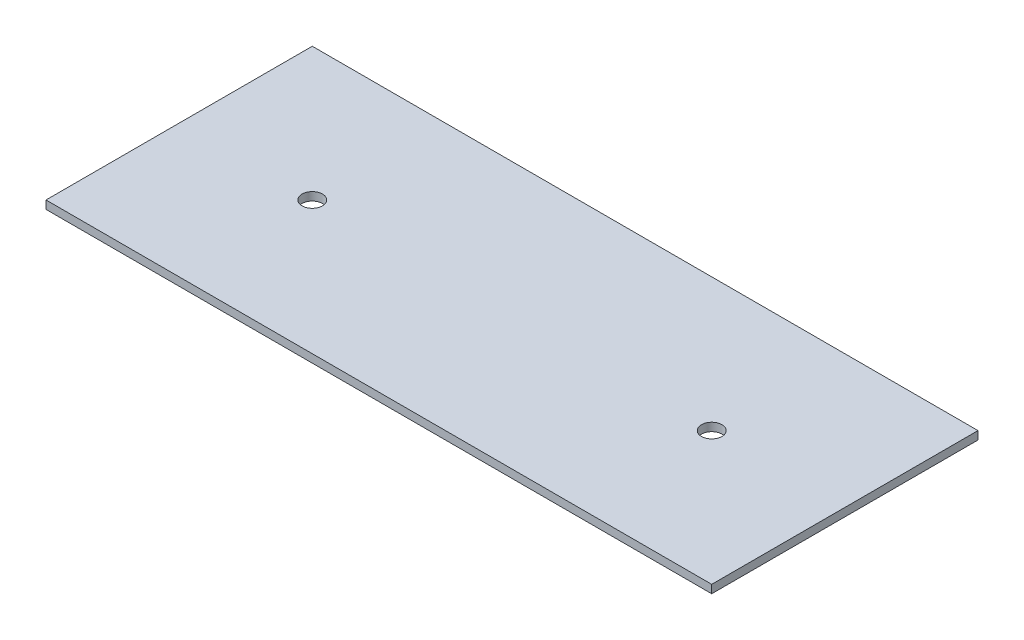
ISO-10303-21;
HEADER;
FILE_DESCRIPTION(('STEP AP214'),'2;1');
FILE_NAME('part.step','',(''),(''),'','','');
FILE_SCHEMA(('AUTOMOTIVE_DESIGN { 1 0 10303 214 1 1 1 1 }'));
ENDSEC;
DATA;
#1=APPLICATION_CONTEXT('core data for automotive mechanical design processes');
#2=APPLICATION_PROTOCOL_DEFINITION('international standard','automotive_design',2000,#1);
#3=PRODUCT_CONTEXT('',#1,'mechanical');
#4=PRODUCT('Part','Part','',(#3));
#5=PRODUCT_RELATED_PRODUCT_CATEGORY('part','',(#4));
#6=PRODUCT_DEFINITION_FORMATION('','',#4);
#7=PRODUCT_DEFINITION_CONTEXT('part definition',#1,'design');
#8=PRODUCT_DEFINITION('design','',#6,#7);
#9=PRODUCT_DEFINITION_SHAPE('','',#8);
#10=(LENGTH_UNIT() NAMED_UNIT(*) SI_UNIT(.MILLI.,.METRE.));
#11=(NAMED_UNIT(*) PLANE_ANGLE_UNIT() SI_UNIT($,.RADIAN.));
#12=(NAMED_UNIT(*) SI_UNIT($,.STERADIAN.) SOLID_ANGLE_UNIT());
#13=UNCERTAINTY_MEASURE_WITH_UNIT(LENGTH_MEASURE(1.E-05),#10,'distance_accuracy_value','');
#14=(GEOMETRIC_REPRESENTATION_CONTEXT(3) GLOBAL_UNCERTAINTY_ASSIGNED_CONTEXT((#13)) GLOBAL_UNIT_ASSIGNED_CONTEXT((#10,
#11,#12)) REPRESENTATION_CONTEXT('',''));
#15=CARTESIAN_POINT('',(0.,0.,0.));
#16=DIRECTION('',(0.,0.,1.));
#17=DIRECTION('',(1.,0.,0.));
#18=AXIS2_PLACEMENT_3D('',#15,#16,#17);
#19=CARTESIAN_POINT('',(0.,1.6,0.));
#20=DIRECTION('',(0.,-1.,0.));
#21=DIRECTION('',(0.,0.,-1.));
#22=AXIS2_PLACEMENT_3D('',#19,#20,#21);
#23=PLANE('',#22);
#24=CARTESIAN_POINT('',(39.,1.6,0.));
#25=DIRECTION('',(0.,1.,0.));
#26=DIRECTION('',(0.,0.,1.));
#27=AXIS2_PLACEMENT_3D('',#24,#25,#26);
#28=CIRCLE('',#27,2.);
#29=CARTESIAN_POINT('',(39.,1.6,2.));
#30=VERTEX_POINT('',#29);
#31=EDGE_CURVE('E100',#30,#30,#28,.T.);
#32=ORIENTED_EDGE('',*,*,#31,.F.);
#33=EDGE_LOOP('',(#32));
#34=FACE_BOUND('',#33,.T.);
#35=DIRECTION('',(0.,0.,-1.));
#36=VECTOR('',#35,1.);
#37=CARTESIAN_POINT('',(65.,1.6,26.));
#38=LINE('',#37,#36);
#39=CARTESIAN_POINT('',(65.,1.6,26.));
#40=VERTEX_POINT('',#39);
#41=CARTESIAN_POINT('',(65.,1.6,-26.));
#42=VERTEX_POINT('',#41);
#43=EDGE_CURVE('E85',#40,#42,#38,.T.);
#44=ORIENTED_EDGE('',*,*,#43,.T.);
#45=DIRECTION('',(-1.,0.,0.));
#46=VECTOR('',#45,1.);
#47=CARTESIAN_POINT('',(-65.,1.6,-26.));
#48=LINE('',#47,#46);
#49=CARTESIAN_POINT('',(-65.,1.6,-26.));
#50=VERTEX_POINT('',#49);
#51=EDGE_CURVE('E80',#42,#50,#48,.T.);
#52=ORIENTED_EDGE('',*,*,#51,.T.);
#53=DIRECTION('',(0.,0.,1.));
#54=VECTOR('',#53,1.);
#55=CARTESIAN_POINT('',(-65.,1.6,26.));
#56=LINE('',#55,#54);
#57=CARTESIAN_POINT('',(-65.,1.6,26.));
#58=VERTEX_POINT('',#57);
#59=EDGE_CURVE('E83',#50,#58,#56,.T.);
#60=ORIENTED_EDGE('',*,*,#59,.T.);
#61=DIRECTION('',(1.,0.,0.));
#62=VECTOR('',#61,1.);
#63=CARTESIAN_POINT('',(-65.,1.6,26.));
#64=LINE('',#63,#62);
#65=EDGE_CURVE('E50',#58,#40,#64,.T.);
#66=ORIENTED_EDGE('',*,*,#65,.T.);
#67=EDGE_LOOP('',(#44,#52,#60,#66));
#68=FACE_BOUND('',#67,.T.);
#69=CARTESIAN_POINT('',(-39.,1.6,0.));
#70=DIRECTION('',(0.,1.,0.));
#71=DIRECTION('',(0.,0.,1.));
#72=AXIS2_PLACEMENT_3D('',#69,#70,#71);
#73=CIRCLE('',#72,2.);
#74=CARTESIAN_POINT('',(-39.,1.6,2.));
#75=VERTEX_POINT('',#74);
#76=EDGE_CURVE('E115',#75,#75,#73,.T.);
#77=ORIENTED_EDGE('',*,*,#76,.F.);
#78=EDGE_LOOP('',(#77));
#79=FACE_BOUND('',#78,.T.);
#80=ADVANCED_FACE('F33',(#34,#68,#79),#23,.F.);
#81=CARTESIAN_POINT('',(0.,0.,0.));
#82=DIRECTION('',(0.,-1.,0.));
#83=DIRECTION('',(0.,0.,-1.));
#84=AXIS2_PLACEMENT_3D('',#81,#82,#83);
#85=PLANE('',#84);
#86=CARTESIAN_POINT('',(39.,0.,0.));
#87=DIRECTION('',(0.,1.,0.));
#88=DIRECTION('',(0.,0.,1.));
#89=AXIS2_PLACEMENT_3D('',#86,#87,#88);
#90=CIRCLE('',#89,2.);
#91=CARTESIAN_POINT('',(39.,0.,2.));
#92=VERTEX_POINT('',#91);
#93=EDGE_CURVE('E112',#92,#92,#90,.T.);
#94=ORIENTED_EDGE('',*,*,#93,.T.);
#95=EDGE_LOOP('',(#94));
#96=FACE_BOUND('',#95,.T.);
#97=DIRECTION('',(0.,0.,-1.));
#98=VECTOR('',#97,1.);
#99=CARTESIAN_POINT('',(65.,0.,26.));
#100=LINE('',#99,#98);
#101=CARTESIAN_POINT('',(65.,0.,26.));
#102=VERTEX_POINT('',#101);
#103=CARTESIAN_POINT('',(65.,0.,-26.));
#104=VERTEX_POINT('',#103);
#105=EDGE_CURVE('E97',#102,#104,#100,.T.);
#106=ORIENTED_EDGE('',*,*,#105,.F.);
#107=DIRECTION('',(1.,0.,0.));
#108=VECTOR('',#107,1.);
#109=CARTESIAN_POINT('',(-65.,0.,26.));
#110=LINE('',#109,#108);
#111=CARTESIAN_POINT('',(-65.,0.,26.));
#112=VERTEX_POINT('',#111);
#113=EDGE_CURVE('E73',#112,#102,#110,.T.);
#114=ORIENTED_EDGE('',*,*,#113,.F.);
#115=DIRECTION('',(0.,0.,1.));
#116=VECTOR('',#115,1.);
#117=CARTESIAN_POINT('',(-65.,0.,26.));
#118=LINE('',#117,#116);
#119=CARTESIAN_POINT('',(-65.,0.,-26.));
#120=VERTEX_POINT('',#119);
#121=EDGE_CURVE('E67',#120,#112,#118,.T.);
#122=ORIENTED_EDGE('',*,*,#121,.F.);
#123=DIRECTION('',(-1.,0.,0.));
#124=VECTOR('',#123,1.);
#125=CARTESIAN_POINT('',(-65.,0.,-26.));
#126=LINE('',#125,#124);
#127=EDGE_CURVE('E89',#104,#120,#126,.T.);
#128=ORIENTED_EDGE('',*,*,#127,.F.);
#129=EDGE_LOOP('',(#106,#114,#122,#128));
#130=FACE_BOUND('',#129,.T.);
#131=CARTESIAN_POINT('',(-39.,0.,0.));
#132=DIRECTION('',(0.,1.,0.));
#133=DIRECTION('',(0.,0.,1.));
#134=AXIS2_PLACEMENT_3D('',#131,#132,#133);
#135=CIRCLE('',#134,2.);
#136=CARTESIAN_POINT('',(-39.,0.,2.));
#137=VERTEX_POINT('',#136);
#138=EDGE_CURVE('E118',#137,#137,#135,.T.);
#139=ORIENTED_EDGE('',*,*,#138,.T.);
#140=EDGE_LOOP('',(#139));
#141=FACE_BOUND('',#140,.T.);
#142=ADVANCED_FACE('F108',(#96,#130,#141),#85,.T.);
#143=CARTESIAN_POINT('',(65.,1.6,26.));
#144=DIRECTION('',(-1.,0.,0.));
#145=DIRECTION('',(0.,0.,1.));
#146=AXIS2_PLACEMENT_3D('',#143,#144,#145);
#147=PLANE('',#146);
#148=ORIENTED_EDGE('',*,*,#105,.T.);
#149=DIRECTION('',(0.,-1.,0.));
#150=VECTOR('',#149,1.);
#151=CARTESIAN_POINT('',(65.,1.6,-26.));
#152=LINE('',#151,#150);
#153=EDGE_CURVE('E11',#42,#104,#152,.T.);
#154=ORIENTED_EDGE('',*,*,#153,.F.);
#155=ORIENTED_EDGE('',*,*,#43,.F.);
#156=DIRECTION('',(0.,-1.,0.));
#157=VECTOR('',#156,1.);
#158=CARTESIAN_POINT('',(65.,1.6,26.));
#159=LINE('',#158,#157);
#160=EDGE_CURVE('E93',#40,#102,#159,.T.);
#161=ORIENTED_EDGE('',*,*,#160,.T.);
#162=EDGE_LOOP('',(#148,#154,#155,#161));
#163=FACE_BOUND('',#162,.T.);
#164=ADVANCED_FACE('F35',(#163),#147,.F.);
#165=CARTESIAN_POINT('',(-65.,1.6,-26.));
#166=DIRECTION('',(0.,0.,1.));
#167=DIRECTION('',(1.,0.,0.));
#168=AXIS2_PLACEMENT_3D('',#165,#166,#167);
#169=PLANE('',#168);
#170=ORIENTED_EDGE('',*,*,#127,.T.);
#171=DIRECTION('',(0.,-1.,0.));
#172=VECTOR('',#171,1.);
#173=CARTESIAN_POINT('',(-65.,1.6,-26.));
#174=LINE('',#173,#172);
#175=EDGE_CURVE('E42',#50,#120,#174,.T.);
#176=ORIENTED_EDGE('',*,*,#175,.F.);
#177=ORIENTED_EDGE('',*,*,#51,.F.);
#178=ORIENTED_EDGE('',*,*,#153,.T.);
#179=EDGE_LOOP('',(#170,#176,#177,#178));
#180=FACE_BOUND('',#179,.T.);
#181=ADVANCED_FACE('F88',(#180),#169,.F.);
#182=CARTESIAN_POINT('',(-65.,1.6,26.));
#183=DIRECTION('',(1.,0.,0.));
#184=DIRECTION('',(0.,0.,-1.));
#185=AXIS2_PLACEMENT_3D('',#182,#183,#184);
#186=PLANE('',#185);
#187=ORIENTED_EDGE('',*,*,#121,.T.);
#188=DIRECTION('',(0.,-1.,0.));
#189=VECTOR('',#188,1.);
#190=CARTESIAN_POINT('',(-65.,1.6,26.));
#191=LINE('',#190,#189);
#192=EDGE_CURVE('E90',#58,#112,#191,.T.);
#193=ORIENTED_EDGE('',*,*,#192,.F.);
#194=ORIENTED_EDGE('',*,*,#59,.F.);
#195=ORIENTED_EDGE('',*,*,#175,.T.);
#196=EDGE_LOOP('',(#187,#193,#194,#195));
#197=FACE_BOUND('',#196,.T.);
#198=ADVANCED_FACE('F91',(#197),#186,.F.);
#199=CARTESIAN_POINT('',(-65.,1.6,26.));
#200=DIRECTION('',(0.,0.,-1.));
#201=DIRECTION('',(-1.,0.,0.));
#202=AXIS2_PLACEMENT_3D('',#199,#200,#201);
#203=PLANE('',#202);
#204=ORIENTED_EDGE('',*,*,#113,.T.);
#205=ORIENTED_EDGE('',*,*,#160,.F.);
#206=ORIENTED_EDGE('',*,*,#65,.F.);
#207=ORIENTED_EDGE('',*,*,#192,.T.);
#208=EDGE_LOOP('',(#204,#205,#206,#207));
#209=FACE_BOUND('',#208,.T.);
#210=ADVANCED_FACE('F105',(#209),#203,.F.);
#211=CARTESIAN_POINT('',(39.,1.6,0.));
#212=DIRECTION('',(0.,-1.,0.));
#213=DIRECTION('',(0.,0.,-1.));
#214=AXIS2_PLACEMENT_3D('',#211,#212,#213);
#215=CYLINDRICAL_SURFACE('',#214,2.);
#216=ORIENTED_EDGE('',*,*,#31,.T.);
#217=EDGE_LOOP('',(#216));
#218=FACE_BOUND('',#217,.T.);
#219=ORIENTED_EDGE('',*,*,#93,.F.);
#220=EDGE_LOOP('',(#219));
#221=FACE_BOUND('',#220,.T.);
#222=ADVANCED_FACE('F136',(#218,#221),#215,.F.);
#223=CARTESIAN_POINT('',(-39.,1.6,0.));
#224=DIRECTION('',(0.,-1.,0.));
#225=DIRECTION('',(0.,0.,-1.));
#226=AXIS2_PLACEMENT_3D('',#223,#224,#225);
#227=CYLINDRICAL_SURFACE('',#226,2.);
#228=ORIENTED_EDGE('',*,*,#76,.T.);
#229=EDGE_LOOP('',(#228));
#230=FACE_BOUND('',#229,.T.);
#231=ORIENTED_EDGE('',*,*,#138,.F.);
#232=EDGE_LOOP('',(#231));
#233=FACE_BOUND('',#232,.T.);
#234=ADVANCED_FACE('F124',(#230,#233),#227,.F.);
#235=CLOSED_SHELL('',(#80,#142,#164,#181,#198,#210,#222,#234));
#236=MANIFOLD_SOLID_BREP('B2',#235);
#237=ADVANCED_BREP_SHAPE_REPRESENTATION('',(#18,#236),#14);
#238=SHAPE_DEFINITION_REPRESENTATION(#9,#237);
ENDSEC;
END-ISO-10303-21;
